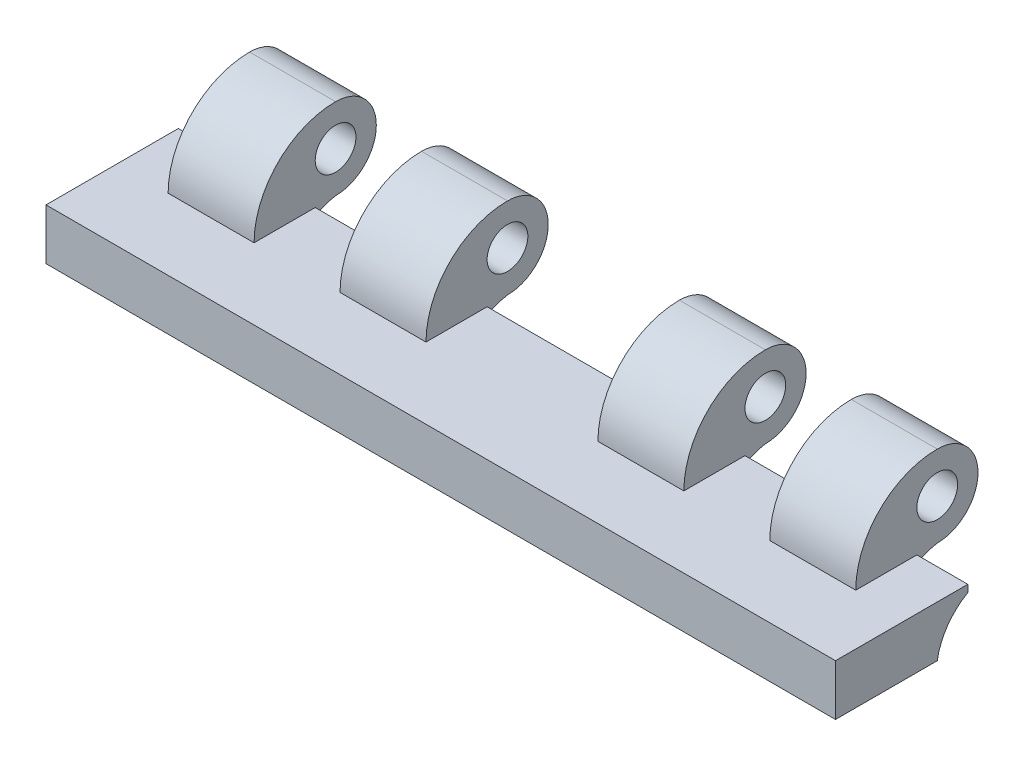
ISO-10303-21;
HEADER;
FILE_DESCRIPTION(('STEP AP214'),'2;1');
FILE_NAME('part.step','',(''),(''),'','','');
FILE_SCHEMA(('AUTOMOTIVE_DESIGN { 1 0 10303 214 1 1 1 1 }'));
ENDSEC;
DATA;
#1=APPLICATION_CONTEXT('core data for automotive mechanical design processes');
#2=APPLICATION_PROTOCOL_DEFINITION('international standard','automotive_design',2000,#1);
#3=PRODUCT_CONTEXT('',#1,'mechanical');
#4=PRODUCT('Part','Part','',(#3));
#5=PRODUCT_RELATED_PRODUCT_CATEGORY('part','',(#4));
#6=PRODUCT_DEFINITION_FORMATION('','',#4);
#7=PRODUCT_DEFINITION_CONTEXT('part definition',#1,'design');
#8=PRODUCT_DEFINITION('design','',#6,#7);
#9=PRODUCT_DEFINITION_SHAPE('','',#8);
#10=(LENGTH_UNIT() NAMED_UNIT(*) SI_UNIT(.MILLI.,.METRE.));
#11=(NAMED_UNIT(*) PLANE_ANGLE_UNIT() SI_UNIT($,.RADIAN.));
#12=(NAMED_UNIT(*) SI_UNIT($,.STERADIAN.) SOLID_ANGLE_UNIT());
#13=UNCERTAINTY_MEASURE_WITH_UNIT(LENGTH_MEASURE(1.E-05),#10,'distance_accuracy_value','');
#14=(GEOMETRIC_REPRESENTATION_CONTEXT(3) GLOBAL_UNCERTAINTY_ASSIGNED_CONTEXT((#13)) GLOBAL_UNIT_ASSIGNED_CONTEXT((#10,
#11,#12)) REPRESENTATION_CONTEXT('',''));
#15=CARTESIAN_POINT('',(0.,0.,0.));
#16=DIRECTION('',(0.,0.,1.));
#17=DIRECTION('',(1.,0.,0.));
#18=AXIS2_PLACEMENT_3D('',#15,#16,#17);
#19=CARTESIAN_POINT('',(-12.4387503050269,4.,76.7454545454545));
#20=DIRECTION('',(0.,0.,1.));
#21=DIRECTION('',(1.,0.,0.));
#22=AXIS2_PLACEMENT_3D('',#19,#20,#21);
#23=PLANE('',#22);
#24=DIRECTION('',(0.,-1.,0.));
#25=VECTOR('',#24,1.);
#26=CARTESIAN_POINT('',(-17.,0.,76.7454545454545));
#27=LINE('',#26,#25);
#28=CARTESIAN_POINT('',(-17.,4.,76.7454545454545));
#29=VERTEX_POINT('',#28);
#30=CARTESIAN_POINT('',(-17.,3.71660104885168,76.7454545454545));
#31=VERTEX_POINT('',#30);
#32=EDGE_CURVE('E415',#29,#31,#27,.T.);
#33=ORIENTED_EDGE('',*,*,#32,.F.);
#34=DIRECTION('',(-1.,0.,0.));
#35=VECTOR('',#34,1.);
#36=CARTESIAN_POINT('',(-12.4387503050269,4.,76.7454545454545));
#37=LINE('',#36,#35);
#38=CARTESIAN_POINT('',(-15.,4.,76.7454545454545));
#39=VERTEX_POINT('',#38);
#40=EDGE_CURVE('E297',#39,#29,#37,.T.);
#41=ORIENTED_EDGE('',*,*,#40,.F.);
#42=DIRECTION('',(0.,-1.,0.));
#43=VECTOR('',#42,1.);
#44=CARTESIAN_POINT('',(-15.,4.,76.7454545454545));
#45=LINE('',#44,#43);
#46=CARTESIAN_POINT('',(-15.,3.71660104885168,76.7454545454545));
#47=VERTEX_POINT('',#46);
#48=EDGE_CURVE('E281',#39,#47,#45,.T.);
#49=ORIENTED_EDGE('',*,*,#48,.T.);
#50=DIRECTION('',(1.,0.,0.));
#51=VECTOR('',#50,1.);
#52=CARTESIAN_POINT('',(-50.4721359549996,3.71660104885168,76.7454545454545));
#53=LINE('',#52,#51);
#54=EDGE_CURVE('E230',#47,#31,#53,.F.);
#55=ORIENTED_EDGE('',*,*,#54,.T.);
#56=EDGE_LOOP('',(#33,#41,#49,#55));
#57=FACE_BOUND('',#56,.T.);
#58=ADVANCED_FACE('F42',(#57),#23,.F.);
#59=DIRECTION('',(0.,1.,0.));
#60=VECTOR('',#59,1.);
#61=CARTESIAN_POINT('',(-20.375,0.,76.7454545454545));
#62=LINE('',#61,#60);
#63=CARTESIAN_POINT('',(-20.375,3.71660104885168,76.7454545454545));
#64=VERTEX_POINT('',#63);
#65=CARTESIAN_POINT('',(-20.375,4.,76.7454545454545));
#66=VERTEX_POINT('',#65);
#67=EDGE_CURVE('E63',#64,#66,#62,.T.);
#68=ORIENTED_EDGE('',*,*,#67,.F.);
#69=CARTESIAN_POINT('',(-23.75,3.71660104885168,76.7454545454545));
#70=VERTEX_POINT('',#69);
#71=EDGE_CURVE('E241',#64,#70,#53,.F.);
#72=ORIENTED_EDGE('',*,*,#71,.T.);
#73=DIRECTION('',(0.,-1.,0.));
#74=VECTOR('',#73,1.);
#75=CARTESIAN_POINT('',(-23.75,0.,76.7454545454545));
#76=LINE('',#75,#74);
#77=CARTESIAN_POINT('',(-23.75,4.,76.7454545454545));
#78=VERTEX_POINT('',#77);
#79=EDGE_CURVE('E409',#78,#70,#76,.T.);
#80=ORIENTED_EDGE('',*,*,#79,.F.);
#81=EDGE_CURVE('E58',#66,#78,#37,.T.);
#82=ORIENTED_EDGE('',*,*,#81,.F.);
#83=EDGE_LOOP('',(#68,#72,#80,#82));
#84=FACE_BOUND('',#83,.T.);
#85=ADVANCED_FACE('F487',(#84),#23,.F.);
#86=DIRECTION('',(0.,1.,0.));
#87=VECTOR('',#86,1.);
#88=CARTESIAN_POINT('',(-27.125,0.,76.7454545454545));
#89=LINE('',#88,#87);
#90=CARTESIAN_POINT('',(-27.125,3.71660104885168,76.7454545454545));
#91=VERTEX_POINT('',#90);
#92=CARTESIAN_POINT('',(-27.125,4.,76.7454545454545));
#93=VERTEX_POINT('',#92);
#94=EDGE_CURVE('E410',#91,#93,#89,.T.);
#95=ORIENTED_EDGE('',*,*,#94,.F.);
#96=CARTESIAN_POINT('',(-33.875,3.71660104885168,76.7454545454545));
#97=VERTEX_POINT('',#96);
#98=EDGE_CURVE('E933',#91,#97,#53,.F.);
#99=ORIENTED_EDGE('',*,*,#98,.T.);
#100=DIRECTION('',(0.,-1.,0.));
#101=VECTOR('',#100,1.);
#102=CARTESIAN_POINT('',(-33.875,0.,76.7454545454545));
#103=LINE('',#102,#101);
#104=CARTESIAN_POINT('',(-33.875,4.,76.7454545454545));
#105=VERTEX_POINT('',#104);
#106=EDGE_CURVE('E390',#105,#97,#103,.T.);
#107=ORIENTED_EDGE('',*,*,#106,.F.);
#108=EDGE_CURVE('E466',#93,#105,#37,.T.);
#109=ORIENTED_EDGE('',*,*,#108,.F.);
#110=EDGE_LOOP('',(#95,#99,#107,#109));
#111=FACE_BOUND('',#110,.T.);
#112=ADVANCED_FACE('F489',(#111),#23,.F.);
#113=DIRECTION('',(0.,1.,0.));
#114=VECTOR('',#113,1.);
#115=CARTESIAN_POINT('',(-37.25,0.,76.7454545454545));
#116=LINE('',#115,#114);
#117=CARTESIAN_POINT('',(-37.25,3.71660104885168,76.7454545454545));
#118=VERTEX_POINT('',#117);
#119=CARTESIAN_POINT('',(-37.25,4.,76.7454545454545));
#120=VERTEX_POINT('',#119);
#121=EDGE_CURVE('E381',#118,#120,#116,.T.);
#122=ORIENTED_EDGE('',*,*,#121,.F.);
#123=CARTESIAN_POINT('',(-40.625,3.71660104885168,76.7454545454545));
#124=VERTEX_POINT('',#123);
#125=EDGE_CURVE('E445',#118,#124,#53,.F.);
#126=ORIENTED_EDGE('',*,*,#125,.T.);
#127=DIRECTION('',(0.,-1.,0.));
#128=VECTOR('',#127,1.);
#129=CARTESIAN_POINT('',(-40.625,0.,76.7454545454545));
#130=LINE('',#129,#128);
#131=CARTESIAN_POINT('',(-40.625,4.,76.7454545454545));
#132=VERTEX_POINT('',#131);
#133=EDGE_CURVE('E375',#132,#124,#130,.T.);
#134=ORIENTED_EDGE('',*,*,#133,.F.);
#135=EDGE_CURVE('E303',#120,#132,#37,.T.);
#136=ORIENTED_EDGE('',*,*,#135,.F.);
#137=EDGE_LOOP('',(#122,#126,#134,#136));
#138=FACE_BOUND('',#137,.T.);
#139=ADVANCED_FACE('F464',(#138),#23,.F.);
#140=CARTESIAN_POINT('',(-46.,4.,81.9407734418525));
#141=DIRECTION('',(1.,0.,0.));
#142=DIRECTION('',(0.,0.,-1.));
#143=AXIS2_PLACEMENT_3D('',#140,#141,#142);
#144=PLANE('',#143);
#145=DIRECTION('',(0.,0.,-1.));
#146=VECTOR('',#145,1.);
#147=CARTESIAN_POINT('',(-46.,4.,81.9407734418525));
#148=LINE('',#147,#146);
#149=CARTESIAN_POINT('',(-46.,4.,81.9407734418525));
#150=VERTEX_POINT('',#149);
#151=CARTESIAN_POINT('',(-46.,4.,76.7454545454545));
#152=VERTEX_POINT('',#151);
#153=EDGE_CURVE('E366',#150,#152,#148,.T.);
#154=ORIENTED_EDGE('',*,*,#153,.T.);
#155=DIRECTION('',(0.,1.,0.));
#156=VECTOR('',#155,1.);
#157=CARTESIAN_POINT('',(-46.,4.,76.7454545454545));
#158=LINE('',#157,#156);
#159=CARTESIAN_POINT('',(-46.,3.71660104885168,76.7454545454545));
#160=VERTEX_POINT('',#159);
#161=EDGE_CURVE('E290',#160,#152,#158,.T.);
#162=ORIENTED_EDGE('',*,*,#161,.F.);
#163=CARTESIAN_POINT('',(-46.,1.60000000000002,75.5454545454546));
#164=DIRECTION('',(1.,0.,0.));
#165=DIRECTION('',(0.,0.,-1.));
#166=AXIS2_PLACEMENT_3D('',#163,#164,#165);
#167=CIRCLE('',#166,2.43310501211927);
#168=CARTESIAN_POINT('',(-46.,2.,77.9454545454545));
#169=VERTEX_POINT('',#168);
#170=EDGE_CURVE('E234',#169,#160,#167,.F.);
#171=ORIENTED_EDGE('',*,*,#170,.F.);
#172=DIRECTION('',(0.,0.,-1.));
#173=VECTOR('',#172,1.);
#174=CARTESIAN_POINT('',(-46.,2.,81.9407734418525));
#175=LINE('',#174,#173);
#176=CARTESIAN_POINT('',(-46.,2.,81.9407734418525));
#177=VERTEX_POINT('',#176);
#178=EDGE_CURVE('E220',#177,#169,#175,.T.);
#179=ORIENTED_EDGE('',*,*,#178,.F.);
#180=DIRECTION('',(0.,-1.,0.));
#181=VECTOR('',#180,1.);
#182=CARTESIAN_POINT('',(-46.,4.,81.9407734418525));
#183=LINE('',#182,#181);
#184=EDGE_CURVE('E355',#150,#177,#183,.T.);
#185=ORIENTED_EDGE('',*,*,#184,.F.);
#186=EDGE_LOOP('',(#154,#162,#171,#179,#185));
#187=FACE_BOUND('',#186,.T.);
#188=ADVANCED_FACE('F440',(#187),#144,.F.);
#189=CARTESIAN_POINT('',(-46.,2.,81.9407734418525));
#190=DIRECTION('',(0.,1.,0.));
#191=DIRECTION('',(0.,0.,1.));
#192=AXIS2_PLACEMENT_3D('',#189,#190,#191);
#193=PLANE('',#192);
#194=ORIENTED_EDGE('',*,*,#178,.T.);
#195=DIRECTION('',(1.,0.,0.));
#196=VECTOR('',#195,1.);
#197=CARTESIAN_POINT('',(-50.4721359549996,2.,77.9454545454545));
#198=LINE('',#197,#196);
#199=CARTESIAN_POINT('',(-15.,2.,77.9454545454545));
#200=VERTEX_POINT('',#199);
#201=EDGE_CURVE('E227',#169,#200,#198,.T.);
#202=ORIENTED_EDGE('',*,*,#201,.T.);
#203=DIRECTION('',(0.,0.,-1.));
#204=VECTOR('',#203,1.);
#205=CARTESIAN_POINT('',(-15.,2.,81.9407734418525));
#206=LINE('',#205,#204);
#207=CARTESIAN_POINT('',(-15.,2.,81.9407734418525));
#208=VERTEX_POINT('',#207);
#209=EDGE_CURVE('E210',#208,#200,#206,.T.);
#210=ORIENTED_EDGE('',*,*,#209,.F.);
#211=DIRECTION('',(1.,0.,0.));
#212=VECTOR('',#211,1.);
#213=CARTESIAN_POINT('',(-46.,2.,81.9407734418525));
#214=LINE('',#213,#212);
#215=EDGE_CURVE('E361',#177,#208,#214,.T.);
#216=ORIENTED_EDGE('',*,*,#215,.F.);
#217=EDGE_LOOP('',(#194,#202,#210,#216));
#218=FACE_BOUND('',#217,.T.);
#219=ADVANCED_FACE('F232',(#218),#193,.F.);
#220=CARTESIAN_POINT('',(-15.,4.,81.9407734418525));
#221=DIRECTION('',(-1.,0.,0.));
#222=DIRECTION('',(0.,0.,1.));
#223=AXIS2_PLACEMENT_3D('',#220,#221,#222);
#224=PLANE('',#223);
#225=ORIENTED_EDGE('',*,*,#209,.T.);
#226=CARTESIAN_POINT('',(-15.,1.60000000000002,75.5454545454546));
#227=DIRECTION('',(1.,0.,0.));
#228=DIRECTION('',(0.,0.,-1.));
#229=AXIS2_PLACEMENT_3D('',#226,#227,#228);
#230=CIRCLE('',#229,2.43310501211927);
#231=EDGE_CURVE('E214',#47,#200,#230,.T.);
#232=ORIENTED_EDGE('',*,*,#231,.F.);
#233=ORIENTED_EDGE('',*,*,#48,.F.);
#234=DIRECTION('',(0.,0.,-1.));
#235=VECTOR('',#234,1.);
#236=CARTESIAN_POINT('',(-15.,4.,81.9407734418525));
#237=LINE('',#236,#235);
#238=CARTESIAN_POINT('',(-15.,4.,81.9407734418525));
#239=VERTEX_POINT('',#238);
#240=EDGE_CURVE('E221',#239,#39,#237,.T.);
#241=ORIENTED_EDGE('',*,*,#240,.F.);
#242=DIRECTION('',(0.,1.,0.));
#243=VECTOR('',#242,1.);
#244=CARTESIAN_POINT('',(-15.,4.,81.9407734418525));
#245=LINE('',#244,#243);
#246=EDGE_CURVE('E217',#208,#239,#245,.T.);
#247=ORIENTED_EDGE('',*,*,#246,.F.);
#248=EDGE_LOOP('',(#225,#232,#233,#241,#247));
#249=FACE_BOUND('',#248,.T.);
#250=ADVANCED_FACE('F212',(#249),#224,.F.);
#251=CARTESIAN_POINT('',(-46.,4.,81.9407734418525));
#252=DIRECTION('',(0.,-1.,0.));
#253=DIRECTION('',(0.,0.,-1.));
#254=AXIS2_PLACEMENT_3D('',#251,#252,#253);
#255=PLANE('',#254);
#256=ORIENTED_EDGE('',*,*,#240,.T.);
#257=ORIENTED_EDGE('',*,*,#40,.T.);
#258=DIRECTION('',(0.,0.,1.));
#259=VECTOR('',#258,1.);
#260=CARTESIAN_POINT('',(-17.,4.,77.5454545454545));
#261=LINE('',#260,#259);
#262=CARTESIAN_POINT('',(-17.,4.,79.1454545454545));
#263=VERTEX_POINT('',#262);
#264=EDGE_CURVE('E339',#29,#263,#261,.T.);
#265=ORIENTED_EDGE('',*,*,#264,.T.);
#266=DIRECTION('',(-1.,0.,0.));
#267=VECTOR('',#266,1.);
#268=CARTESIAN_POINT('',(-12.4745166004061,4.,79.1454545454545));
#269=LINE('',#268,#267);
#270=CARTESIAN_POINT('',(-20.375,4.,79.1454545454545));
#271=VERTEX_POINT('',#270);
#272=EDGE_CURVE('E345',#263,#271,#269,.T.);
#273=ORIENTED_EDGE('',*,*,#272,.T.);
#274=DIRECTION('',(0.,0.,1.));
#275=VECTOR('',#274,1.);
#276=CARTESIAN_POINT('',(-20.375,4.,77.5454545454545));
#277=LINE('',#276,#275);
#278=EDGE_CURVE('E319',#66,#271,#277,.T.);
#279=ORIENTED_EDGE('',*,*,#278,.F.);
#280=ORIENTED_EDGE('',*,*,#81,.T.);
#281=DIRECTION('',(0.,0.,1.));
#282=VECTOR('',#281,1.);
#283=CARTESIAN_POINT('',(-23.75,4.,77.5454545454545));
#284=LINE('',#283,#282);
#285=CARTESIAN_POINT('',(-23.75,4.,79.1454545454545));
#286=VERTEX_POINT('',#285);
#287=EDGE_CURVE('E313',#78,#286,#284,.T.);
#288=ORIENTED_EDGE('',*,*,#287,.T.);
#289=DIRECTION('',(-1.,0.,0.));
#290=VECTOR('',#289,1.);
#291=CARTESIAN_POINT('',(-12.4745166004061,4.,79.1454545454545));
#292=LINE('',#291,#290);
#293=CARTESIAN_POINT('',(-27.125,4.,79.1454545454545));
#294=VERTEX_POINT('',#293);
#295=EDGE_CURVE('E321',#286,#294,#292,.T.);
#296=ORIENTED_EDGE('',*,*,#295,.T.);
#297=DIRECTION('',(0.,0.,1.));
#298=VECTOR('',#297,1.);
#299=CARTESIAN_POINT('',(-27.125,4.,77.5454545454545));
#300=LINE('',#299,#298);
#301=EDGE_CURVE('E254',#93,#294,#300,.T.);
#302=ORIENTED_EDGE('',*,*,#301,.F.);
#303=ORIENTED_EDGE('',*,*,#108,.T.);
#304=DIRECTION('',(0.,0.,1.));
#305=VECTOR('',#304,1.);
#306=CARTESIAN_POINT('',(-33.875,4.,77.5454545454545));
#307=LINE('',#306,#305);
#308=CARTESIAN_POINT('',(-33.875,4.,79.1454545454545));
#309=VERTEX_POINT('',#308);
#310=EDGE_CURVE('E279',#105,#309,#307,.T.);
#311=ORIENTED_EDGE('',*,*,#310,.T.);
#312=DIRECTION('',(-1.,0.,0.));
#313=VECTOR('',#312,1.);
#314=CARTESIAN_POINT('',(-12.4745166004061,4.,79.1454545454545));
#315=LINE('',#314,#313);
#316=CARTESIAN_POINT('',(-37.25,4.,79.1454545454545));
#317=VERTEX_POINT('',#316);
#318=EDGE_CURVE('E282',#309,#317,#315,.T.);
#319=ORIENTED_EDGE('',*,*,#318,.T.);
#320=DIRECTION('',(0.,0.,1.));
#321=VECTOR('',#320,1.);
#322=CARTESIAN_POINT('',(-37.25,4.,77.5454545454545));
#323=LINE('',#322,#321);
#324=EDGE_CURVE('E255',#120,#317,#323,.T.);
#325=ORIENTED_EDGE('',*,*,#324,.F.);
#326=ORIENTED_EDGE('',*,*,#135,.T.);
#327=DIRECTION('',(0.,0.,1.));
#328=VECTOR('',#327,1.);
#329=CARTESIAN_POINT('',(-40.625,4.,77.5454545454545));
#330=LINE('',#329,#328);
#331=CARTESIAN_POINT('',(-40.625,4.,79.1454545454545));
#332=VERTEX_POINT('',#331);
#333=EDGE_CURVE('E252',#132,#332,#330,.T.);
#334=ORIENTED_EDGE('',*,*,#333,.T.);
#335=DIRECTION('',(-1.,0.,0.));
#336=VECTOR('',#335,1.);
#337=CARTESIAN_POINT('',(-12.4745166004061,4.,79.1454545454545));
#338=LINE('',#337,#336);
#339=CARTESIAN_POINT('',(-44.,4.,79.1454545454545));
#340=VERTEX_POINT('',#339);
#341=EDGE_CURVE('E256',#332,#340,#338,.T.);
#342=ORIENTED_EDGE('',*,*,#341,.T.);
#343=DIRECTION('',(0.,0.,-1.));
#344=VECTOR('',#343,1.);
#345=CARTESIAN_POINT('',(-44.,4.,77.5454545454545));
#346=LINE('',#345,#344);
#347=CARTESIAN_POINT('',(-44.,4.,76.7454545454545));
#348=VERTEX_POINT('',#347);
#349=EDGE_CURVE('E248',#340,#348,#346,.T.);
#350=ORIENTED_EDGE('',*,*,#349,.T.);
#351=EDGE_CURVE('E300',#348,#152,#37,.T.);
#352=ORIENTED_EDGE('',*,*,#351,.T.);
#353=ORIENTED_EDGE('',*,*,#153,.F.);
#354=DIRECTION('',(-1.,0.,0.));
#355=VECTOR('',#354,1.);
#356=CARTESIAN_POINT('',(-46.,4.,81.9407734418525));
#357=LINE('',#356,#355);
#358=EDGE_CURVE('E364',#239,#150,#357,.T.);
#359=ORIENTED_EDGE('',*,*,#358,.F.);
#360=EDGE_LOOP('',(#256,#257,#265,#273,#279,#280,#288,#296,#302,#303,#311,#319,#325,#326,#334,
#342,#350,#352,#353,#359));
#361=FACE_BOUND('',#360,.T.);
#362=ADVANCED_FACE('F430',(#361),#255,.F.);
#363=CARTESIAN_POINT('',(0.,0.,81.9407734418525));
#364=DIRECTION('',(0.,0.,1.));
#365=DIRECTION('',(1.,0.,0.));
#366=AXIS2_PLACEMENT_3D('',#363,#364,#365);
#367=PLANE('',#366);
#368=ORIENTED_EDGE('',*,*,#184,.T.);
#369=ORIENTED_EDGE('',*,*,#215,.T.);
#370=ORIENTED_EDGE('',*,*,#246,.T.);
#371=ORIENTED_EDGE('',*,*,#358,.T.);
#372=EDGE_LOOP('',(#368,#369,#370,#371));
#373=FACE_BOUND('',#372,.T.);
#374=ADVANCED_FACE('F438',(#373),#367,.T.);
#375=CARTESIAN_POINT('',(-50.5254833995939,5.6,75.9454545454545));
#376=DIRECTION('',(1.,0.,0.));
#377=DIRECTION('',(0.,0.,-1.));
#378=AXIS2_PLACEMENT_3D('',#375,#376,#377);
#379=CYLINDRICAL_SURFACE('',#378,1.60000000000001);
#380=DIRECTION('',(-1.,0.,0.));
#381=VECTOR('',#380,1.);
#382=CARTESIAN_POINT('',(-12.4745166004061,7.2,75.9454545454545));
#383=LINE('',#382,#381);
#384=CARTESIAN_POINT('',(-17.,7.2,75.9454545454545));
#385=VERTEX_POINT('',#384);
#386=CARTESIAN_POINT('',(-20.375,7.2,75.9454545454545));
#387=VERTEX_POINT('',#386);
#388=EDGE_CURVE('E341',#385,#387,#383,.T.);
#389=ORIENTED_EDGE('',*,*,#388,.F.);
#390=CARTESIAN_POINT('',(-17.,5.6,75.9454545454545));
#391=DIRECTION('',(1.,0.,0.));
#392=DIRECTION('',(0.,0.,-1.));
#393=AXIS2_PLACEMENT_3D('',#390,#391,#392);
#394=CIRCLE('',#393,1.60000000000001);
#395=CARTESIAN_POINT('',(-17.,4.,75.9454545454545));
#396=VERTEX_POINT('',#395);
#397=EDGE_CURVE('E330',#385,#396,#394,.F.);
#398=ORIENTED_EDGE('',*,*,#397,.T.);
#399=DIRECTION('',(1.,0.,0.));
#400=VECTOR('',#399,1.);
#401=CARTESIAN_POINT('',(-48.262741699797,4.,75.9454545454545));
#402=LINE('',#401,#400);
#403=CARTESIAN_POINT('',(-20.375,4.,75.9454545454545));
#404=VERTEX_POINT('',#403);
#405=EDGE_CURVE('E336',#404,#396,#402,.T.);
#406=ORIENTED_EDGE('',*,*,#405,.F.);
#407=CARTESIAN_POINT('',(-20.375,5.6,75.9454545454545));
#408=DIRECTION('',(1.,0.,0.));
#409=DIRECTION('',(0.,0.,-1.));
#410=AXIS2_PLACEMENT_3D('',#407,#408,#409);
#411=CIRCLE('',#410,1.60000000000001);
#412=EDGE_CURVE('E344',#387,#404,#411,.F.);
#413=ORIENTED_EDGE('',*,*,#412,.F.);
#414=EDGE_LOOP('',(#389,#398,#406,#413));
#415=FACE_BOUND('',#414,.T.);
#416=ADVANCED_FACE('F677',(#415),#379,.T.);
#417=CARTESIAN_POINT('',(-12.4745166004061,3.99999999999996,75.9454545454545));
#418=DIRECTION('',(-1.,0.,0.));
#419=DIRECTION('',(0.,0.,1.));
#420=AXIS2_PLACEMENT_3D('',#417,#418,#419);
#421=CYLINDRICAL_SURFACE('',#420,3.2);
#422=ORIENTED_EDGE('',*,*,#388,.T.);
#423=CARTESIAN_POINT('',(-20.375,3.99999999999996,75.9454545454545));
#424=DIRECTION('',(1.,0.,0.));
#425=DIRECTION('',(0.,0.,-1.));
#426=AXIS2_PLACEMENT_3D('',#423,#424,#425);
#427=CIRCLE('',#426,3.2);
#428=EDGE_CURVE('E353',#387,#271,#427,.T.);
#429=ORIENTED_EDGE('',*,*,#428,.T.);
#430=ORIENTED_EDGE('',*,*,#272,.F.);
#431=CARTESIAN_POINT('',(-17.,3.99999999999996,75.9454545454545));
#432=DIRECTION('',(1.,0.,0.));
#433=DIRECTION('',(0.,0.,-1.));
#434=AXIS2_PLACEMENT_3D('',#431,#432,#433);
#435=CIRCLE('',#434,3.2);
#436=EDGE_CURVE('E348',#385,#263,#435,.T.);
#437=ORIENTED_EDGE('',*,*,#436,.F.);
#438=EDGE_LOOP('',(#422,#429,#430,#437));
#439=FACE_BOUND('',#438,.T.);
#440=ADVANCED_FACE('F427',(#439),#421,.T.);
#441=CARTESIAN_POINT('',(-14.737258300203,5.6,75.9454545454545));
#442=DIRECTION('',(-1.,0.,0.));
#443=DIRECTION('',(0.,0.,1.));
#444=AXIS2_PLACEMENT_3D('',#441,#442,#443);
#445=CYLINDRICAL_SURFACE('',#444,0.80000000000001);
#446=CARTESIAN_POINT('',(-20.375,5.6,75.9454545454545));
#447=DIRECTION('',(1.,0.,0.));
#448=DIRECTION('',(0.,0.,-1.));
#449=AXIS2_PLACEMENT_3D('',#446,#447,#448);
#450=CIRCLE('',#449,0.80000000000001);
#451=CARTESIAN_POINT('',(-20.375,5.6,75.1454545454545));
#452=VERTEX_POINT('',#451);
#453=EDGE_CURVE('E333',#452,#452,#450,.F.);
#454=ORIENTED_EDGE('',*,*,#453,.T.);
#455=EDGE_LOOP('',(#454));
#456=FACE_BOUND('',#455,.T.);
#457=CARTESIAN_POINT('',(-17.,5.6,75.9454545454545));
#458=DIRECTION('',(1.,0.,0.));
#459=DIRECTION('',(0.,0.,-1.));
#460=AXIS2_PLACEMENT_3D('',#457,#458,#459);
#461=CIRCLE('',#460,0.80000000000001);
#462=CARTESIAN_POINT('',(-17.,5.6,75.1454545454545));
#463=VERTEX_POINT('',#462);
#464=EDGE_CURVE('E332',#463,#463,#461,.F.);
#465=ORIENTED_EDGE('',*,*,#464,.F.);
#466=EDGE_LOOP('',(#465));
#467=FACE_BOUND('',#466,.T.);
#468=ADVANCED_FACE('F679',(#456,#467),#445,.F.);
#469=CARTESIAN_POINT('',(-50.5254833995939,5.6,75.9454545454545));
#470=DIRECTION('',(1.,0.,0.));
#471=DIRECTION('',(0.,0.,-1.));
#472=AXIS2_PLACEMENT_3D('',#469,#470,#471);
#473=CYLINDRICAL_SURFACE('',#472,1.60000000000001);
#474=DIRECTION('',(-1.,0.,0.));
#475=VECTOR('',#474,1.);
#476=CARTESIAN_POINT('',(-12.4745166004061,7.2,75.9454545454545));
#477=LINE('',#476,#475);
#478=CARTESIAN_POINT('',(-23.75,7.2,75.9454545454545));
#479=VERTEX_POINT('',#478);
#480=CARTESIAN_POINT('',(-27.125,7.2,75.9454545454545));
#481=VERTEX_POINT('',#480);
#482=EDGE_CURVE('E310',#479,#481,#477,.T.);
#483=ORIENTED_EDGE('',*,*,#482,.F.);
#484=CARTESIAN_POINT('',(-23.75,5.6,75.9454545454545));
#485=DIRECTION('',(1.,0.,0.));
#486=DIRECTION('',(0.,0.,-1.));
#487=AXIS2_PLACEMENT_3D('',#484,#485,#486);
#488=CIRCLE('',#487,1.60000000000001);
#489=CARTESIAN_POINT('',(-23.75,4.,75.9454545454545));
#490=VERTEX_POINT('',#489);
#491=EDGE_CURVE('E307',#479,#490,#488,.F.);
#492=ORIENTED_EDGE('',*,*,#491,.T.);
#493=DIRECTION('',(1.,0.,0.));
#494=VECTOR('',#493,1.);
#495=CARTESIAN_POINT('',(-46.8487137123388,4.,75.9454545454545));
#496=LINE('',#495,#494);
#497=CARTESIAN_POINT('',(-27.125,4.,75.9454545454545));
#498=VERTEX_POINT('',#497);
#499=EDGE_CURVE('E396',#498,#490,#496,.T.);
#500=ORIENTED_EDGE('',*,*,#499,.F.);
#501=CARTESIAN_POINT('',(-27.125,5.6,75.9454545454545));
#502=DIRECTION('',(1.,0.,0.));
#503=DIRECTION('',(0.,0.,-1.));
#504=AXIS2_PLACEMENT_3D('',#501,#502,#503);
#505=CIRCLE('',#504,1.60000000000001);
#506=EDGE_CURVE('E304',#481,#498,#505,.F.);
#507=ORIENTED_EDGE('',*,*,#506,.F.);
#508=EDGE_LOOP('',(#483,#492,#500,#507));
#509=FACE_BOUND('',#508,.T.);
#510=ADVANCED_FACE('F689',(#509),#473,.T.);
#511=CARTESIAN_POINT('',(-12.4745166004061,3.99999999999996,75.9454545454545));
#512=DIRECTION('',(-1.,0.,0.));
#513=DIRECTION('',(0.,0.,1.));
#514=AXIS2_PLACEMENT_3D('',#511,#512,#513);
#515=CYLINDRICAL_SURFACE('',#514,3.2);
#516=CARTESIAN_POINT('',(-23.75,3.99999999999996,75.9454545454545));
#517=DIRECTION('',(1.,0.,0.));
#518=DIRECTION('',(0.,0.,-1.));
#519=AXIS2_PLACEMENT_3D('',#516,#517,#518);
#520=CIRCLE('',#519,3.2);
#521=EDGE_CURVE('E317',#479,#286,#520,.T.);
#522=ORIENTED_EDGE('',*,*,#521,.F.);
#523=ORIENTED_EDGE('',*,*,#482,.T.);
#524=CARTESIAN_POINT('',(-27.125,3.99999999999996,75.9454545454545));
#525=DIRECTION('',(1.,0.,0.));
#526=DIRECTION('',(0.,0.,-1.));
#527=AXIS2_PLACEMENT_3D('',#524,#525,#526);
#528=CIRCLE('',#527,3.2);
#529=EDGE_CURVE('E320',#481,#294,#528,.T.);
#530=ORIENTED_EDGE('',*,*,#529,.T.);
#531=ORIENTED_EDGE('',*,*,#295,.F.);
#532=EDGE_LOOP('',(#522,#523,#530,#531));
#533=FACE_BOUND('',#532,.T.);
#534=ADVANCED_FACE('F481',(#533),#515,.T.);
#535=CARTESIAN_POINT('',(-14.737258300203,5.6,75.9454545454545));
#536=DIRECTION('',(-1.,0.,0.));
#537=DIRECTION('',(0.,0.,1.));
#538=AXIS2_PLACEMENT_3D('',#535,#536,#537);
#539=CYLINDRICAL_SURFACE('',#538,0.80000000000001);
#540=CARTESIAN_POINT('',(-27.125,5.6,75.9454545454545));
#541=DIRECTION('',(1.,0.,0.));
#542=DIRECTION('',(0.,0.,-1.));
#543=AXIS2_PLACEMENT_3D('',#540,#541,#542);
#544=CIRCLE('',#543,0.80000000000001);
#545=CARTESIAN_POINT('',(-27.125,5.6,75.1454545454545));
#546=VERTEX_POINT('',#545);
#547=EDGE_CURVE('E306',#546,#546,#544,.T.);
#548=ORIENTED_EDGE('',*,*,#547,.F.);
#549=EDGE_LOOP('',(#548));
#550=FACE_BOUND('',#549,.T.);
#551=CARTESIAN_POINT('',(-23.75,5.6,75.9454545454545));
#552=DIRECTION('',(1.,0.,0.));
#553=DIRECTION('',(0.,0.,-1.));
#554=AXIS2_PLACEMENT_3D('',#551,#552,#553);
#555=CIRCLE('',#554,0.80000000000001);
#556=CARTESIAN_POINT('',(-23.75,5.6,75.1454545454545));
#557=VERTEX_POINT('',#556);
#558=EDGE_CURVE('E316',#557,#557,#555,.F.);
#559=ORIENTED_EDGE('',*,*,#558,.F.);
#560=EDGE_LOOP('',(#559));
#561=FACE_BOUND('',#560,.T.);
#562=ADVANCED_FACE('F471',(#550,#561),#539,.F.);
#563=DIRECTION('',(0.,1.,0.));
#564=VECTOR('',#563,1.);
#565=CARTESIAN_POINT('',(-44.,0.,76.7454545454545));
#566=LINE('',#565,#564);
#567=CARTESIAN_POINT('',(-44.,3.71660104885168,76.7454545454545));
#568=VERTEX_POINT('',#567);
#569=EDGE_CURVE('E370',#568,#348,#566,.T.);
#570=ORIENTED_EDGE('',*,*,#569,.F.);
#571=EDGE_CURVE('E236',#568,#160,#53,.F.);
#572=ORIENTED_EDGE('',*,*,#571,.T.);
#573=ORIENTED_EDGE('',*,*,#161,.T.);
#574=ORIENTED_EDGE('',*,*,#351,.F.);
#575=EDGE_LOOP('',(#570,#572,#573,#574));
#576=FACE_BOUND('',#575,.T.);
#577=ADVANCED_FACE('F468',(#576),#23,.F.);
#578=CARTESIAN_POINT('',(-50.5254833995939,5.6,75.9454545454545));
#579=DIRECTION('',(1.,0.,0.));
#580=DIRECTION('',(0.,0.,-1.));
#581=AXIS2_PLACEMENT_3D('',#578,#579,#580);
#582=CYLINDRICAL_SURFACE('',#581,1.60000000000001);
#583=DIRECTION('',(-1.,0.,0.));
#584=VECTOR('',#583,1.);
#585=CARTESIAN_POINT('',(-12.4745166004061,7.2,75.9454545454545));
#586=LINE('',#585,#584);
#587=CARTESIAN_POINT('',(-33.875,7.2,75.9454545454545));
#588=VERTEX_POINT('',#587);
#589=CARTESIAN_POINT('',(-37.25,7.2,75.9454545454545));
#590=VERTEX_POINT('',#589);
#591=EDGE_CURVE('E273',#588,#590,#586,.T.);
#592=ORIENTED_EDGE('',*,*,#591,.F.);
#593=CARTESIAN_POINT('',(-33.875,5.6,75.9454545454545));
#594=DIRECTION('',(1.,0.,0.));
#595=DIRECTION('',(0.,0.,-1.));
#596=AXIS2_PLACEMENT_3D('',#593,#594,#595);
#597=CIRCLE('',#596,1.60000000000001);
#598=CARTESIAN_POINT('',(-33.875,4.,75.9454545454545));
#599=VERTEX_POINT('',#598);
#600=EDGE_CURVE('E274',#588,#599,#597,.F.);
#601=ORIENTED_EDGE('',*,*,#600,.T.);
#602=DIRECTION('',(1.,0.,0.));
#603=VECTOR('',#602,1.);
#604=CARTESIAN_POINT('',(-46.8487137123388,4.,75.9454545454545));
#605=LINE('',#604,#603);
#606=CARTESIAN_POINT('',(-37.25,4.,75.9454545454545));
#607=VERTEX_POINT('',#606);
#608=EDGE_CURVE('E393',#607,#599,#605,.T.);
#609=ORIENTED_EDGE('',*,*,#608,.F.);
#610=CARTESIAN_POINT('',(-37.25,5.6,75.9454545454545));
#611=DIRECTION('',(1.,0.,0.));
#612=DIRECTION('',(0.,0.,-1.));
#613=AXIS2_PLACEMENT_3D('',#610,#611,#612);
#614=CIRCLE('',#613,1.60000000000001);
#615=EDGE_CURVE('E264',#590,#607,#614,.F.);
#616=ORIENTED_EDGE('',*,*,#615,.F.);
#617=EDGE_LOOP('',(#592,#601,#609,#616));
#618=FACE_BOUND('',#617,.T.);
#619=ADVANCED_FACE('F470',(#618),#582,.T.);
#620=CARTESIAN_POINT('',(-12.4745166004061,3.99999999999996,75.9454545454545));
#621=DIRECTION('',(-1.,0.,0.));
#622=DIRECTION('',(0.,0.,1.));
#623=AXIS2_PLACEMENT_3D('',#620,#621,#622);
#624=CYLINDRICAL_SURFACE('',#623,3.2);
#625=ORIENTED_EDGE('',*,*,#591,.T.);
#626=CARTESIAN_POINT('',(-37.25,3.99999999999996,75.9454545454545));
#627=DIRECTION('',(1.,0.,0.));
#628=DIRECTION('',(0.,0.,-1.));
#629=AXIS2_PLACEMENT_3D('',#626,#627,#628);
#630=CIRCLE('',#629,3.2);
#631=EDGE_CURVE('E284',#590,#317,#630,.T.);
#632=ORIENTED_EDGE('',*,*,#631,.T.);
#633=ORIENTED_EDGE('',*,*,#318,.F.);
#634=CARTESIAN_POINT('',(-33.875,3.99999999999996,75.9454545454545));
#635=DIRECTION('',(1.,0.,0.));
#636=DIRECTION('',(0.,0.,-1.));
#637=AXIS2_PLACEMENT_3D('',#634,#635,#636);
#638=CIRCLE('',#637,3.2);
#639=EDGE_CURVE('E287',#588,#309,#638,.T.);
#640=ORIENTED_EDGE('',*,*,#639,.F.);
#641=EDGE_LOOP('',(#625,#632,#633,#640));
#642=FACE_BOUND('',#641,.T.);
#643=ADVANCED_FACE('F478',(#642),#624,.T.);
#644=CARTESIAN_POINT('',(-14.737258300203,5.6,75.9454545454545));
#645=DIRECTION('',(-1.,0.,0.));
#646=DIRECTION('',(0.,0.,1.));
#647=AXIS2_PLACEMENT_3D('',#644,#645,#646);
#648=CYLINDRICAL_SURFACE('',#647,0.80000000000001);
#649=CARTESIAN_POINT('',(-37.25,5.6,75.9454545454545));
#650=DIRECTION('',(1.,0.,0.));
#651=DIRECTION('',(0.,0.,-1.));
#652=AXIS2_PLACEMENT_3D('',#649,#650,#651);
#653=CIRCLE('',#652,0.80000000000001);
#654=CARTESIAN_POINT('',(-37.25,5.6,75.1454545454545));
#655=VERTEX_POINT('',#654);
#656=EDGE_CURVE('E276',#655,#655,#653,.F.);
#657=ORIENTED_EDGE('',*,*,#656,.T.);
#658=EDGE_LOOP('',(#657));
#659=FACE_BOUND('',#658,.T.);
#660=CARTESIAN_POINT('',(-33.875,5.6,75.9454545454545));
#661=DIRECTION('',(1.,0.,0.));
#662=DIRECTION('',(0.,0.,-1.));
#663=AXIS2_PLACEMENT_3D('',#660,#661,#662);
#664=CIRCLE('',#663,0.80000000000001);
#665=CARTESIAN_POINT('',(-33.875,5.6,75.1454545454545));
#666=VERTEX_POINT('',#665);
#667=EDGE_CURVE('E270',#666,#666,#664,.T.);
#668=ORIENTED_EDGE('',*,*,#667,.T.);
#669=EDGE_LOOP('',(#668));
#670=FACE_BOUND('',#669,.T.);
#671=ADVANCED_FACE('F473',(#659,#670),#648,.F.);
#672=CARTESIAN_POINT('',(-50.5254833995939,5.6,75.9454545454545));
#673=DIRECTION('',(1.,0.,0.));
#674=DIRECTION('',(0.,0.,-1.));
#675=AXIS2_PLACEMENT_3D('',#672,#673,#674);
#676=CYLINDRICAL_SURFACE('',#675,1.60000000000001);
#677=DIRECTION('',(-1.,0.,0.));
#678=VECTOR('',#677,1.);
#679=CARTESIAN_POINT('',(-12.4745166004061,7.2,75.9454545454545));
#680=LINE('',#679,#678);
#681=CARTESIAN_POINT('',(-40.625,7.2,75.9454545454545));
#682=VERTEX_POINT('',#681);
#683=CARTESIAN_POINT('',(-44.,7.2,75.9454545454545));
#684=VERTEX_POINT('',#683);
#685=EDGE_CURVE('E251',#682,#684,#680,.T.);
#686=ORIENTED_EDGE('',*,*,#685,.F.);
#687=CARTESIAN_POINT('',(-40.625,5.6,75.9454545454545));
#688=DIRECTION('',(1.,0.,0.));
#689=DIRECTION('',(0.,0.,-1.));
#690=AXIS2_PLACEMENT_3D('',#687,#688,#689);
#691=CIRCLE('',#690,1.60000000000001);
#692=CARTESIAN_POINT('',(-40.625,3.99999999999999,75.9454545454545));
#693=VERTEX_POINT('',#692);
#694=EDGE_CURVE('E245',#682,#693,#691,.F.);
#695=ORIENTED_EDGE('',*,*,#694,.T.);
#696=DIRECTION('',(1.,0.,0.));
#697=VECTOR('',#696,1.);
#698=CARTESIAN_POINT('',(-46.8487137123388,4.,75.9454545454545));
#699=LINE('',#698,#697);
#700=CARTESIAN_POINT('',(-44.,4.,75.9454545454545));
#701=VERTEX_POINT('',#700);
#702=EDGE_CURVE('E378',#701,#693,#699,.T.);
#703=ORIENTED_EDGE('',*,*,#702,.F.);
#704=CARTESIAN_POINT('',(-44.,5.6,75.9454545454545));
#705=DIRECTION('',(-1.,0.,0.));
#706=DIRECTION('',(0.,0.,1.));
#707=AXIS2_PLACEMENT_3D('',#704,#705,#706);
#708=CIRCLE('',#707,1.60000000000001);
#709=EDGE_CURVE('E242',#701,#684,#708,.F.);
#710=ORIENTED_EDGE('',*,*,#709,.T.);
#711=EDGE_LOOP('',(#686,#695,#703,#710));
#712=FACE_BOUND('',#711,.T.);
#713=ADVANCED_FACE('F454',(#712),#676,.T.);
#714=CARTESIAN_POINT('',(-12.4745166004061,3.99999999999996,75.9454545454545));
#715=DIRECTION('',(-1.,0.,0.));
#716=DIRECTION('',(0.,0.,1.));
#717=AXIS2_PLACEMENT_3D('',#714,#715,#716);
#718=CYLINDRICAL_SURFACE('',#717,3.2);
#719=CARTESIAN_POINT('',(-40.625,3.99999999999996,75.9454545454545));
#720=DIRECTION('',(1.,0.,0.));
#721=DIRECTION('',(0.,0.,-1.));
#722=AXIS2_PLACEMENT_3D('',#719,#720,#721);
#723=CIRCLE('',#722,3.2);
#724=EDGE_CURVE('E258',#682,#332,#723,.T.);
#725=ORIENTED_EDGE('',*,*,#724,.F.);
#726=ORIENTED_EDGE('',*,*,#685,.T.);
#727=CARTESIAN_POINT('',(-44.,3.99999999999996,75.9454545454545));
#728=DIRECTION('',(-1.,0.,0.));
#729=DIRECTION('',(0.,0.,1.));
#730=AXIS2_PLACEMENT_3D('',#727,#728,#729);
#731=CIRCLE('',#730,3.2);
#732=EDGE_CURVE('E259',#684,#340,#731,.F.);
#733=ORIENTED_EDGE('',*,*,#732,.T.);
#734=ORIENTED_EDGE('',*,*,#341,.F.);
#735=EDGE_LOOP('',(#725,#726,#733,#734));
#736=FACE_BOUND('',#735,.T.);
#737=ADVANCED_FACE('F496',(#736),#718,.T.);
#738=CARTESIAN_POINT('',(-14.737258300203,5.6,75.9454545454545));
#739=DIRECTION('',(-1.,0.,0.));
#740=DIRECTION('',(0.,0.,1.));
#741=AXIS2_PLACEMENT_3D('',#738,#739,#740);
#742=CYLINDRICAL_SURFACE('',#741,0.80000000000001);
#743=CARTESIAN_POINT('',(-44.,5.6,75.9454545454545));
#744=DIRECTION('',(-1.,0.,0.));
#745=DIRECTION('',(0.,0.,1.));
#746=AXIS2_PLACEMENT_3D('',#743,#744,#745);
#747=CIRCLE('',#746,0.80000000000001);
#748=CARTESIAN_POINT('',(-44.,5.6,76.7454545454545));
#749=VERTEX_POINT('',#748);
#750=EDGE_CURVE('E244',#749,#749,#747,.T.);
#751=ORIENTED_EDGE('',*,*,#750,.T.);
#752=EDGE_LOOP('',(#751));
#753=FACE_BOUND('',#752,.T.);
#754=CARTESIAN_POINT('',(-40.625,5.6,75.9454545454545));
#755=DIRECTION('',(1.,0.,0.));
#756=DIRECTION('',(0.,0.,-1.));
#757=AXIS2_PLACEMENT_3D('',#754,#755,#756);
#758=CIRCLE('',#757,0.80000000000001);
#759=CARTESIAN_POINT('',(-40.625,5.6,75.1454545454545));
#760=VERTEX_POINT('',#759);
#761=EDGE_CURVE('E240',#760,#760,#758,.F.);
#762=ORIENTED_EDGE('',*,*,#761,.F.);
#763=EDGE_LOOP('',(#762));
#764=FACE_BOUND('',#763,.T.);
#765=ADVANCED_FACE('F502',(#753,#764),#742,.F.);
#766=CARTESIAN_POINT('',(-40.625,0.,0.));
#767=DIRECTION('',(1.,0.,0.));
#768=DIRECTION('',(0.,0.,-1.));
#769=AXIS2_PLACEMENT_3D('',#766,#767,#768);
#770=PLANE('',#769);
#771=CARTESIAN_POINT('',(-40.625,1.59999999999421,75.5454545454504));
#772=DIRECTION('',(1.,0.,0.));
#773=DIRECTION('',(0.,0.,-1.));
#774=AXIS2_PLACEMENT_3D('',#771,#772,#773);
#775=CIRCLE('',#774,2.43310501212432);
#776=EDGE_CURVE('E371',#693,#124,#775,.T.);
#777=ORIENTED_EDGE('',*,*,#776,.F.);
#778=ORIENTED_EDGE('',*,*,#694,.F.);
#779=ORIENTED_EDGE('',*,*,#724,.T.);
#780=ORIENTED_EDGE('',*,*,#333,.F.);
#781=ORIENTED_EDGE('',*,*,#133,.T.);
#782=EDGE_LOOP('',(#777,#778,#779,#780,#781));
#783=FACE_BOUND('',#782,.T.);
#784=ORIENTED_EDGE('',*,*,#761,.T.);
#785=EDGE_LOOP('',(#784));
#786=FACE_BOUND('',#785,.T.);
#787=ADVANCED_FACE('F460',(#783,#786),#770,.T.);
#788=CARTESIAN_POINT('',(-44.,0.,0.));
#789=DIRECTION('',(-1.,0.,0.));
#790=DIRECTION('',(0.,0.,1.));
#791=AXIS2_PLACEMENT_3D('',#788,#789,#790);
#792=PLANE('',#791);
#793=CARTESIAN_POINT('',(-44.,1.59999999999421,75.5454545454504));
#794=DIRECTION('',(-1.,0.,0.));
#795=DIRECTION('',(0.,0.,1.));
#796=AXIS2_PLACEMENT_3D('',#793,#794,#795);
#797=CIRCLE('',#796,2.43310501212432);
#798=EDGE_CURVE('E374',#568,#701,#797,.T.);
#799=ORIENTED_EDGE('',*,*,#798,.F.);
#800=ORIENTED_EDGE('',*,*,#569,.T.);
#801=ORIENTED_EDGE('',*,*,#349,.F.);
#802=ORIENTED_EDGE('',*,*,#732,.F.);
#803=ORIENTED_EDGE('',*,*,#709,.F.);
#804=EDGE_LOOP('',(#799,#800,#801,#802,#803));
#805=FACE_BOUND('',#804,.T.);
#806=ORIENTED_EDGE('',*,*,#750,.F.);
#807=EDGE_LOOP('',(#806));
#808=FACE_BOUND('',#807,.T.);
#809=ADVANCED_FACE('F447',(#805,#808),#792,.T.);
#810=CARTESIAN_POINT('',(-33.875,0.,0.));
#811=DIRECTION('',(1.,0.,0.));
#812=DIRECTION('',(0.,0.,-1.));
#813=AXIS2_PLACEMENT_3D('',#810,#811,#812);
#814=PLANE('',#813);
#815=CARTESIAN_POINT('',(-33.875,1.59999999999421,75.5454545454504));
#816=DIRECTION('',(1.,0.,0.));
#817=DIRECTION('',(0.,0.,-1.));
#818=AXIS2_PLACEMENT_3D('',#815,#816,#817);
#819=CIRCLE('',#818,2.43310501212432);
#820=EDGE_CURVE('E386',#599,#97,#819,.T.);
#821=ORIENTED_EDGE('',*,*,#820,.F.);
#822=ORIENTED_EDGE('',*,*,#600,.F.);
#823=ORIENTED_EDGE('',*,*,#639,.T.);
#824=ORIENTED_EDGE('',*,*,#310,.F.);
#825=ORIENTED_EDGE('',*,*,#106,.T.);
#826=EDGE_LOOP('',(#821,#822,#823,#824,#825));
#827=FACE_BOUND('',#826,.T.);
#828=ORIENTED_EDGE('',*,*,#667,.F.);
#829=EDGE_LOOP('',(#828));
#830=FACE_BOUND('',#829,.T.);
#831=ADVANCED_FACE('F537',(#827,#830),#814,.T.);
#832=CARTESIAN_POINT('',(-37.25,0.,0.));
#833=DIRECTION('',(-1.,0.,0.));
#834=DIRECTION('',(0.,0.,1.));
#835=AXIS2_PLACEMENT_3D('',#832,#833,#834);
#836=PLANE('',#835);
#837=CARTESIAN_POINT('',(-37.25,1.59999999999421,75.5454545454504));
#838=DIRECTION('',(-1.,0.,0.));
#839=DIRECTION('',(0.,0.,1.));
#840=AXIS2_PLACEMENT_3D('',#837,#838,#839);
#841=CIRCLE('',#840,2.43310501212432);
#842=EDGE_CURVE('E389',#118,#607,#841,.T.);
#843=ORIENTED_EDGE('',*,*,#842,.F.);
#844=ORIENTED_EDGE('',*,*,#121,.T.);
#845=ORIENTED_EDGE('',*,*,#324,.T.);
#846=ORIENTED_EDGE('',*,*,#631,.F.);
#847=ORIENTED_EDGE('',*,*,#615,.T.);
#848=EDGE_LOOP('',(#843,#844,#845,#846,#847));
#849=FACE_BOUND('',#848,.T.);
#850=ORIENTED_EDGE('',*,*,#656,.F.);
#851=EDGE_LOOP('',(#850));
#852=FACE_BOUND('',#851,.T.);
#853=ADVANCED_FACE('F529',(#849,#852),#836,.T.);
#854=CARTESIAN_POINT('',(-23.75,0.,0.));
#855=DIRECTION('',(1.,0.,0.));
#856=DIRECTION('',(0.,0.,-1.));
#857=AXIS2_PLACEMENT_3D('',#854,#855,#856);
#858=PLANE('',#857);
#859=CARTESIAN_POINT('',(-23.75,1.59999999999421,75.5454545454504));
#860=DIRECTION('',(1.,0.,0.));
#861=DIRECTION('',(0.,0.,-1.));
#862=AXIS2_PLACEMENT_3D('',#859,#860,#861);
#863=CIRCLE('',#862,2.43310501212432);
#864=EDGE_CURVE('E406',#490,#70,#863,.T.);
#865=ORIENTED_EDGE('',*,*,#864,.F.);
#866=ORIENTED_EDGE('',*,*,#491,.F.);
#867=ORIENTED_EDGE('',*,*,#521,.T.);
#868=ORIENTED_EDGE('',*,*,#287,.F.);
#869=ORIENTED_EDGE('',*,*,#79,.T.);
#870=EDGE_LOOP('',(#865,#866,#867,#868,#869));
#871=FACE_BOUND('',#870,.T.);
#872=ORIENTED_EDGE('',*,*,#558,.T.);
#873=EDGE_LOOP('',(#872));
#874=FACE_BOUND('',#873,.T.);
#875=ADVANCED_FACE('F556',(#871,#874),#858,.T.);
#876=CARTESIAN_POINT('',(-27.125,0.,0.));
#877=DIRECTION('',(-1.,0.,0.));
#878=DIRECTION('',(0.,0.,1.));
#879=AXIS2_PLACEMENT_3D('',#876,#877,#878);
#880=PLANE('',#879);
#881=CARTESIAN_POINT('',(-27.125,1.59999999999421,75.5454545454504));
#882=DIRECTION('',(-1.,0.,0.));
#883=DIRECTION('',(0.,0.,1.));
#884=AXIS2_PLACEMENT_3D('',#881,#882,#883);
#885=CIRCLE('',#884,2.43310501212432);
#886=EDGE_CURVE('E403',#91,#498,#885,.T.);
#887=ORIENTED_EDGE('',*,*,#886,.F.);
#888=ORIENTED_EDGE('',*,*,#94,.T.);
#889=ORIENTED_EDGE('',*,*,#301,.T.);
#890=ORIENTED_EDGE('',*,*,#529,.F.);
#891=ORIENTED_EDGE('',*,*,#506,.T.);
#892=EDGE_LOOP('',(#887,#888,#889,#890,#891));
#893=FACE_BOUND('',#892,.T.);
#894=ORIENTED_EDGE('',*,*,#547,.T.);
#895=EDGE_LOOP('',(#894));
#896=FACE_BOUND('',#895,.T.);
#897=ADVANCED_FACE('F548',(#893,#896),#880,.T.);
#898=CARTESIAN_POINT('',(-17.,0.,0.));
#899=DIRECTION('',(1.,0.,0.));
#900=DIRECTION('',(0.,0.,-1.));
#901=AXIS2_PLACEMENT_3D('',#898,#899,#900);
#902=PLANE('',#901);
#903=CARTESIAN_POINT('',(-17.,1.59999999999421,75.5454545454504));
#904=DIRECTION('',(1.,0.,0.));
#905=DIRECTION('',(0.,0.,-1.));
#906=AXIS2_PLACEMENT_3D('',#903,#904,#905);
#907=CIRCLE('',#906,2.43310501212432);
#908=EDGE_CURVE('E46',#396,#31,#907,.T.);
#909=ORIENTED_EDGE('',*,*,#908,.F.);
#910=ORIENTED_EDGE('',*,*,#397,.F.);
#911=ORIENTED_EDGE('',*,*,#436,.T.);
#912=ORIENTED_EDGE('',*,*,#264,.F.);
#913=ORIENTED_EDGE('',*,*,#32,.T.);
#914=EDGE_LOOP('',(#909,#910,#911,#912,#913));
#915=FACE_BOUND('',#914,.T.);
#916=ORIENTED_EDGE('',*,*,#464,.T.);
#917=EDGE_LOOP('',(#916));
#918=FACE_BOUND('',#917,.T.);
#919=ADVANCED_FACE('F422',(#915,#918),#902,.T.);
#920=CARTESIAN_POINT('',(-20.375,0.,0.));
#921=DIRECTION('',(-1.,0.,0.));
#922=DIRECTION('',(0.,0.,1.));
#923=AXIS2_PLACEMENT_3D('',#920,#921,#922);
#924=PLANE('',#923);
#925=CARTESIAN_POINT('',(-20.375,1.59999999999421,75.5454545454504));
#926=DIRECTION('',(-1.,0.,0.));
#927=DIRECTION('',(0.,0.,1.));
#928=AXIS2_PLACEMENT_3D('',#925,#926,#927);
#929=CIRCLE('',#928,2.43310501212432);
#930=EDGE_CURVE('E11',#64,#404,#929,.T.);
#931=ORIENTED_EDGE('',*,*,#930,.F.);
#932=ORIENTED_EDGE('',*,*,#67,.T.);
#933=ORIENTED_EDGE('',*,*,#278,.T.);
#934=ORIENTED_EDGE('',*,*,#428,.F.);
#935=ORIENTED_EDGE('',*,*,#412,.T.);
#936=EDGE_LOOP('',(#931,#932,#933,#934,#935));
#937=FACE_BOUND('',#936,.T.);
#938=ORIENTED_EDGE('',*,*,#453,.F.);
#939=EDGE_LOOP('',(#938));
#940=FACE_BOUND('',#939,.T.);
#941=ADVANCED_FACE('F584',(#937,#940),#924,.T.);
#942=CARTESIAN_POINT('',(-46.8487137123388,1.59999999999421,75.5454545454504));
#943=DIRECTION('',(1.,0.,0.));
#944=DIRECTION('',(0.,0.,-1.));
#945=AXIS2_PLACEMENT_3D('',#942,#943,#944);
#946=CYLINDRICAL_SURFACE('',#945,2.43310501212432);
#947=ORIENTED_EDGE('',*,*,#405,.T.);
#948=ORIENTED_EDGE('',*,*,#908,.T.);
#949=ORIENTED_EDGE('',*,*,#54,.F.);
#950=ORIENTED_EDGE('',*,*,#231,.T.);
#951=ORIENTED_EDGE('',*,*,#201,.F.);
#952=ORIENTED_EDGE('',*,*,#170,.T.);
#953=ORIENTED_EDGE('',*,*,#571,.F.);
#954=ORIENTED_EDGE('',*,*,#798,.T.);
#955=ORIENTED_EDGE('',*,*,#702,.T.);
#956=ORIENTED_EDGE('',*,*,#776,.T.);
#957=ORIENTED_EDGE('',*,*,#125,.F.);
#958=ORIENTED_EDGE('',*,*,#842,.T.);
#959=ORIENTED_EDGE('',*,*,#608,.T.);
#960=ORIENTED_EDGE('',*,*,#820,.T.);
#961=ORIENTED_EDGE('',*,*,#98,.F.);
#962=ORIENTED_EDGE('',*,*,#886,.T.);
#963=ORIENTED_EDGE('',*,*,#499,.T.);
#964=ORIENTED_EDGE('',*,*,#864,.T.);
#965=ORIENTED_EDGE('',*,*,#71,.F.);
#966=ORIENTED_EDGE('',*,*,#930,.T.);
#967=EDGE_LOOP('',(#947,#948,#949,#950,#951,#952,#953,#954,#955,#956,#957,#958,#959,#960,#961,
#962,#963,#964,#965,#966));
#968=FACE_BOUND('',#967,.T.);
#969=ADVANCED_FACE('F44',(#968),#946,.F.);
#970=CLOSED_SHELL('',(#58,#85,#112,#139,#188,#219,#250,#362,#374,#416,#440,#468,#510,#534,#562,
#577,#619,#643,#671,#713,#737,#765,#787,#809,#831,#853,#875,#897,#919,#941,#969));
#971=MANIFOLD_SOLID_BREP('B2',#970);
#972=ADVANCED_BREP_SHAPE_REPRESENTATION('',(#18,#971),#14);
#973=SHAPE_DEFINITION_REPRESENTATION(#9,#972);
ENDSEC;
END-ISO-10303-21;
